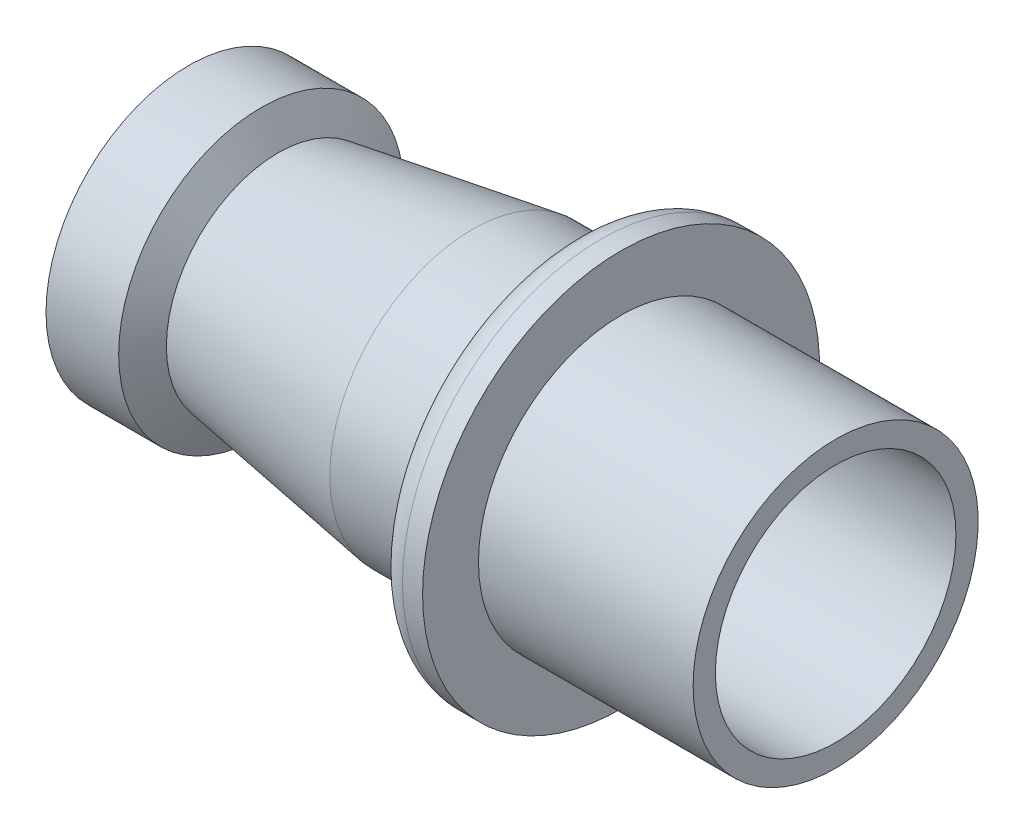
ISO-10303-21;
HEADER;
FILE_DESCRIPTION(('STEP AP214'),'2;1');
FILE_NAME('part.step','',(''),(''),'','','');
FILE_SCHEMA(('AUTOMOTIVE_DESIGN { 1 0 10303 214 1 1 1 1 }'));
ENDSEC;
DATA;
#1=APPLICATION_CONTEXT('core data for automotive mechanical design processes');
#2=APPLICATION_PROTOCOL_DEFINITION('international standard','automotive_design',2000,#1);
#3=PRODUCT_CONTEXT('',#1,'mechanical');
#4=PRODUCT('Part','Part','',(#3));
#5=PRODUCT_RELATED_PRODUCT_CATEGORY('part','',(#4));
#6=PRODUCT_DEFINITION_FORMATION('','',#4);
#7=PRODUCT_DEFINITION_CONTEXT('part definition',#1,'design');
#8=PRODUCT_DEFINITION('design','',#6,#7);
#9=PRODUCT_DEFINITION_SHAPE('','',#8);
#10=(LENGTH_UNIT() NAMED_UNIT(*) SI_UNIT(.MILLI.,.METRE.));
#11=(NAMED_UNIT(*) PLANE_ANGLE_UNIT() SI_UNIT($,.RADIAN.));
#12=(NAMED_UNIT(*) SI_UNIT($,.STERADIAN.) SOLID_ANGLE_UNIT());
#13=UNCERTAINTY_MEASURE_WITH_UNIT(LENGTH_MEASURE(1.E-05),#10,'distance_accuracy_value','');
#14=(GEOMETRIC_REPRESENTATION_CONTEXT(3) GLOBAL_UNCERTAINTY_ASSIGNED_CONTEXT((#13)) GLOBAL_UNIT_ASSIGNED_CONTEXT((#10,
#11,#12)) REPRESENTATION_CONTEXT('',''));
#15=CARTESIAN_POINT('',(0.,0.,0.));
#16=DIRECTION('',(0.,0.,1.));
#17=DIRECTION('',(1.,0.,0.));
#18=AXIS2_PLACEMENT_3D('',#15,#16,#17);
#19=CARTESIAN_POINT('',(82.894279842665,146.295332749387,0.));
#20=DIRECTION('',(-1.,0.,0.));
#21=DIRECTION('',(0.,0.,0.999999999999999));
#22=AXIS2_PLACEMENT_3D('',#19,#20,#21);
#23=CYLINDRICAL_SURFACE('',#22,0.647700000000001);
#24=CARTESIAN_POINT('',(87.1868798426582,146.295332749387,0.));
#25=DIRECTION('',(-1.,0.,0.));
#26=DIRECTION('',(0.,0.,0.999999999999999));
#27=AXIS2_PLACEMENT_3D('',#24,#25,#26);
#28=CIRCLE('',#27,0.647700000000001);
#29=CARTESIAN_POINT('',(87.1868798426582,146.295332749387,0.64769999999998));
#30=VERTEX_POINT('',#29);
#31=EDGE_CURVE('E99',#30,#30,#28,.T.);
#32=ORIENTED_EDGE('',*,*,#31,.F.);
#33=EDGE_LOOP('',(#32));
#34=FACE_BOUND('',#33,.T.);
#35=CARTESIAN_POINT('',(87.5170798426569,146.295332749387,0.));
#36=DIRECTION('',(-1.,0.,0.));
#37=DIRECTION('',(0.,0.,0.999999999999999));
#38=AXIS2_PLACEMENT_3D('',#35,#36,#37);
#39=CIRCLE('',#38,0.647700000000001);
#40=CARTESIAN_POINT('',(87.5170798426569,146.295332749387,0.64769999999998));
#41=VERTEX_POINT('',#40);
#42=EDGE_CURVE('E52',#41,#41,#39,.T.);
#43=ORIENTED_EDGE('',*,*,#42,.T.);
#44=EDGE_LOOP('',(#43));
#45=FACE_BOUND('',#44,.T.);
#46=ADVANCED_FACE('F39',(#34,#45),#23,.T.);
#47=CARTESIAN_POINT('',(87.5941597639321,146.295332749387,0.));
#48=DIRECTION('',(-1.,0.,0.));
#49=DIRECTION('',(0.,0.,0.999999999999999));
#50=AXIS2_PLACEMENT_3D('',#47,#48,#49);
#51=CONICAL_SURFACE('',#50,0.508000000000008,1.06660808974981);
#52=ORIENTED_EDGE('',*,*,#42,.F.);
#53=EDGE_LOOP('',(#52));
#54=FACE_BOUND('',#53,.T.);
#55=CARTESIAN_POINT('',(87.5941597639321,146.295332749387,0.));
#56=DIRECTION('',(-1.,0.,0.));
#57=DIRECTION('',(0.,0.,0.999999999999999));
#58=AXIS2_PLACEMENT_3D('',#55,#56,#57);
#59=CIRCLE('',#58,0.508000000000008);
#60=CARTESIAN_POINT('',(87.5941597639321,146.295332749387,0.507999999999987));
#61=VERTEX_POINT('',#60);
#62=EDGE_CURVE('E57',#61,#61,#59,.T.);
#63=ORIENTED_EDGE('',*,*,#62,.T.);
#64=EDGE_LOOP('',(#63));
#65=FACE_BOUND('',#64,.T.);
#66=ADVANCED_FACE('F108',(#54,#65),#51,.T.);
#67=CARTESIAN_POINT('',(88.4765268110271,146.295332749387,0.));
#68=DIRECTION('',(1.,0.,0.));
#69=DIRECTION('',(0.,0.,-0.999999999999999));
#70=AXIS2_PLACEMENT_3D('',#67,#68,#69);
#71=CONICAL_SURFACE('',#70,0.647699999992729,0.157020803145841);
#72=ORIENTED_EDGE('',*,*,#62,.F.);
#73=EDGE_LOOP('',(#72));
#74=FACE_BOUND('',#73,.T.);
#75=CARTESIAN_POINT('',(88.4765268110271,146.295332749387,0.));
#76=DIRECTION('',(-1.,0.,0.));
#77=DIRECTION('',(0.,0.,0.999999999999999));
#78=AXIS2_PLACEMENT_3D('',#75,#76,#77);
#79=CIRCLE('',#78,0.647699999992729);
#80=CARTESIAN_POINT('',(88.4765268110271,146.295332749387,0.647699999992708));
#81=VERTEX_POINT('',#80);
#82=EDGE_CURVE('E63',#81,#81,#79,.T.);
#83=ORIENTED_EDGE('',*,*,#82,.T.);
#84=EDGE_LOOP('',(#83));
#85=FACE_BOUND('',#84,.T.);
#86=ADVANCED_FACE('F113',(#74,#85),#71,.T.);
#87=CARTESIAN_POINT('',(82.894279842665,146.295332749387,0.));
#88=DIRECTION('',(-1.,0.,0.));
#89=DIRECTION('',(0.,0.,0.999999999999999));
#90=AXIS2_PLACEMENT_3D('',#87,#88,#89);
#91=CYLINDRICAL_SURFACE('',#90,0.647699999992729);
#92=ORIENTED_EDGE('',*,*,#82,.F.);
#93=EDGE_LOOP('',(#92));
#94=FACE_BOUND('',#93,.T.);
#95=CARTESIAN_POINT('',(88.8981668110271,146.295332749387,0.));
#96=DIRECTION('',(-1.,0.,0.));
#97=DIRECTION('',(0.,0.,0.999999999999999));
#98=AXIS2_PLACEMENT_3D('',#95,#96,#97);
#99=CIRCLE('',#98,0.647699999992729);
#100=CARTESIAN_POINT('',(88.8981668110271,146.295332749387,0.647699999992708));
#101=VERTEX_POINT('',#100);
#102=EDGE_CURVE('E67',#101,#101,#99,.T.);
#103=ORIENTED_EDGE('',*,*,#102,.T.);
#104=EDGE_LOOP('',(#103));
#105=FACE_BOUND('',#104,.T.);
#106=ADVANCED_FACE('F119',(#94,#105),#91,.T.);
#107=CARTESIAN_POINT('',(88.9616668110271,146.295332749387,0.));
#108=DIRECTION('',(1.,0.,0.));
#109=DIRECTION('',(0.,0.,-0.999999999999999));
#110=AXIS2_PLACEMENT_3D('',#107,#108,#109);
#111=CONICAL_SURFACE('',#110,0.901699999992733,1.32581766366801);
#112=CARTESIAN_POINT('',(88.937617317122,146.295332749387,0.));
#113=DIRECTION('',(-1.,0.,0.));
#114=DIRECTION('',(0.,0.,0.999999999999999));
#115=AXIS2_PLACEMENT_3D('',#112,#113,#114);
#116=CIRCLE('',#115,0.80550202437235);
#117=CARTESIAN_POINT('',(88.937617317122,146.295332749387,0.805502024372329));
#118=VERTEX_POINT('',#117);
#119=EDGE_CURVE('E47',#118,#118,#116,.T.);
#120=ORIENTED_EDGE('',*,*,#119,.T.);
#121=EDGE_LOOP('',(#120));
#122=FACE_BOUND('',#121,.T.);
#123=ORIENTED_EDGE('',*,*,#102,.F.);
#124=EDGE_LOOP('',(#123));
#125=FACE_BOUND('',#124,.T.);
#126=ADVANCED_FACE('F125',(#122,#125),#111,.T.);
#127=CARTESIAN_POINT('',(82.894279842665,146.295332749387,0.));
#128=DIRECTION('',(-1.,0.,0.));
#129=DIRECTION('',(0.,0.,0.999999999999999));
#130=AXIS2_PLACEMENT_3D('',#127,#128,#129);
#131=CYLINDRICAL_SURFACE('',#130,0.901699999992733);
#132=CARTESIAN_POINT('',(89.0608254146405,146.295332749387,0.));
#133=DIRECTION('',(1.,0.,0.));
#134=DIRECTION('',(0.,0.,-0.999999999999999));
#135=AXIS2_PLACEMENT_3D('',#132,#133,#134);
#136=CIRCLE('',#135,0.901699999992733);
#137=CARTESIAN_POINT('',(89.0608254146405,146.295332749387,-0.901699999992754));
#138=VERTEX_POINT('',#137);
#139=EDGE_CURVE('E10',#138,#138,#136,.T.);
#140=ORIENTED_EDGE('',*,*,#139,.T.);
#141=EDGE_LOOP('',(#140));
#142=FACE_BOUND('',#141,.T.);
#143=CARTESIAN_POINT('',(89.1521668110271,146.295332749387,0.));
#144=DIRECTION('',(-1.,0.,0.));
#145=DIRECTION('',(0.,0.,0.999999999999999));
#146=AXIS2_PLACEMENT_3D('',#143,#144,#145);
#147=CIRCLE('',#146,0.901699999992733);
#148=CARTESIAN_POINT('',(89.1521668110271,146.295332749387,0.901699999992712));
#149=VERTEX_POINT('',#148);
#150=EDGE_CURVE('E71',#149,#149,#147,.T.);
#151=ORIENTED_EDGE('',*,*,#150,.T.);
#152=EDGE_LOOP('',(#151));
#153=FACE_BOUND('',#152,.T.);
#154=ADVANCED_FACE('F130',(#142,#153),#131,.T.);
#155=CARTESIAN_POINT('',(89.1521668110271,147.19703274938,0.));
#156=DIRECTION('',(-1.,0.,0.));
#157=DIRECTION('',(0.,0.,0.999999999999999));
#158=AXIS2_PLACEMENT_3D('',#155,#156,#157);
#159=PLANE('',#158);
#160=ORIENTED_EDGE('',*,*,#150,.F.);
#161=EDGE_LOOP('',(#160));
#162=FACE_BOUND('',#161,.T.);
#163=CARTESIAN_POINT('',(89.1521668110271,146.295332749387,0.));
#164=DIRECTION('',(-1.,0.,0.));
#165=DIRECTION('',(0.,0.,0.999999999999999));
#166=AXIS2_PLACEMENT_3D('',#163,#164,#165);
#167=CIRCLE('',#166,0.647699999992729);
#168=CARTESIAN_POINT('',(89.1521668110271,146.295332749387,0.647699999992708));
#169=VERTEX_POINT('',#168);
#170=EDGE_CURVE('E75',#169,#169,#167,.T.);
#171=ORIENTED_EDGE('',*,*,#170,.T.);
#172=EDGE_LOOP('',(#171));
#173=FACE_BOUND('',#172,.T.);
#174=ADVANCED_FACE('F135',(#162,#173),#159,.F.);
#175=CARTESIAN_POINT('',(82.894279842665,146.295332749387,0.));
#176=DIRECTION('',(-1.,0.,0.));
#177=DIRECTION('',(0.,0.,0.999999999999999));
#178=AXIS2_PLACEMENT_3D('',#175,#176,#177);
#179=CYLINDRICAL_SURFACE('',#178,0.647699999992729);
#180=ORIENTED_EDGE('',*,*,#170,.F.);
#181=EDGE_LOOP('',(#180));
#182=FACE_BOUND('',#181,.T.);
#183=CARTESIAN_POINT('',(90.1275268110412,146.295332749387,0.));
#184=DIRECTION('',(-1.,0.,0.));
#185=DIRECTION('',(0.,0.,0.999999999999999));
#186=AXIS2_PLACEMENT_3D('',#183,#184,#185);
#187=CIRCLE('',#186,0.647699999992729);
#188=CARTESIAN_POINT('',(90.1275268110412,146.295332749387,0.647699999992708));
#189=VERTEX_POINT('',#188);
#190=EDGE_CURVE('E79',#189,#189,#187,.T.);
#191=ORIENTED_EDGE('',*,*,#190,.T.);
#192=EDGE_LOOP('',(#191));
#193=FACE_BOUND('',#192,.T.);
#194=ADVANCED_FACE('F140',(#182,#193),#179,.T.);
#195=CARTESIAN_POINT('',(90.1275268110412,146.94303274938,0.));
#196=DIRECTION('',(-1.,0.,0.));
#197=DIRECTION('',(0.,0.,0.999999999999999));
#198=AXIS2_PLACEMENT_3D('',#195,#196,#197);
#199=PLANE('',#198);
#200=ORIENTED_EDGE('',*,*,#190,.F.);
#201=EDGE_LOOP('',(#200));
#202=FACE_BOUND('',#201,.T.);
#203=CARTESIAN_POINT('',(90.1275268110412,146.295332749387,0.));
#204=DIRECTION('',(-1.,0.,0.));
#205=DIRECTION('',(0.,0.,0.999999999999999));
#206=AXIS2_PLACEMENT_3D('',#203,#204,#205);
#207=CIRCLE('',#206,0.546638375874042);
#208=CARTESIAN_POINT('',(90.1275268110412,146.295332749387,0.546638375874021));
#209=VERTEX_POINT('',#208);
#210=EDGE_CURVE('E83',#209,#209,#207,.T.);
#211=ORIENTED_EDGE('',*,*,#210,.T.);
#212=EDGE_LOOP('',(#211));
#213=FACE_BOUND('',#212,.T.);
#214=ADVANCED_FACE('F144',(#202,#213),#199,.F.);
#215=CARTESIAN_POINT('',(82.894279842665,146.295332749387,0.));
#216=DIRECTION('',(-1.,0.,0.));
#217=DIRECTION('',(0.,0.,0.999999999999999));
#218=AXIS2_PLACEMENT_3D('',#215,#216,#217);
#219=CYLINDRICAL_SURFACE('',#218,0.546638375874042);
#220=ORIENTED_EDGE('',*,*,#210,.F.);
#221=EDGE_LOOP('',(#220));
#222=FACE_BOUND('',#221,.T.);
#223=CARTESIAN_POINT('',(88.6289268110324,146.295332749387,0.));
#224=DIRECTION('',(-1.,0.,0.));
#225=DIRECTION('',(0.,0.,0.999999999999999));
#226=AXIS2_PLACEMENT_3D('',#223,#224,#225);
#227=CIRCLE('',#226,0.546638375874042);
#228=CARTESIAN_POINT('',(88.6289268110324,146.295332749387,0.546638375874021));
#229=VERTEX_POINT('',#228);
#230=EDGE_CURVE('E87',#229,#229,#227,.T.);
#231=ORIENTED_EDGE('',*,*,#230,.T.);
#232=EDGE_LOOP('',(#231));
#233=FACE_BOUND('',#232,.T.);
#234=ADVANCED_FACE('F148',(#222,#233),#219,.F.);
#235=CARTESIAN_POINT('',(88.6289268110324,146.841971125261,0.));
#236=DIRECTION('',(-1.,0.,0.));
#237=DIRECTION('',(0.,0.,0.999999999999999));
#238=AXIS2_PLACEMENT_3D('',#235,#236,#237);
#239=PLANE('',#238);
#240=ORIENTED_EDGE('',*,*,#230,.F.);
#241=EDGE_LOOP('',(#240));
#242=FACE_BOUND('',#241,.T.);
#243=CARTESIAN_POINT('',(88.6289268110324,146.295332749387,0.));
#244=DIRECTION('',(-1.,0.,0.));
#245=DIRECTION('',(0.,0.,0.999999999999999));
#246=AXIS2_PLACEMENT_3D('',#243,#244,#245);
#247=CIRCLE('',#246,0.419638375878856);
#248=CARTESIAN_POINT('',(88.6289268110324,146.295332749387,0.419638375878835));
#249=VERTEX_POINT('',#248);
#250=EDGE_CURVE('E91',#249,#249,#247,.T.);
#251=ORIENTED_EDGE('',*,*,#250,.T.);
#252=EDGE_LOOP('',(#251));
#253=FACE_BOUND('',#252,.T.);
#254=ADVANCED_FACE('F152',(#242,#253),#239,.F.);
#255=CARTESIAN_POINT('',(82.894279842665,146.295332749387,0.));
#256=DIRECTION('',(-1.,0.,0.));
#257=DIRECTION('',(0.,0.,0.999999999999999));
#258=AXIS2_PLACEMENT_3D('',#255,#256,#257);
#259=CYLINDRICAL_SURFACE('',#258,0.419638375878856);
#260=ORIENTED_EDGE('',*,*,#250,.F.);
#261=EDGE_LOOP('',(#260));
#262=FACE_BOUND('',#261,.T.);
#263=CARTESIAN_POINT('',(87.1868798426582,146.295332749387,0.));
#264=DIRECTION('',(-1.,0.,0.));
#265=DIRECTION('',(0.,0.,0.999999999999999));
#266=AXIS2_PLACEMENT_3D('',#263,#264,#265);
#267=CIRCLE('',#266,0.419638375878856);
#268=CARTESIAN_POINT('',(87.1868798426582,146.295332749387,0.419638375878835));
#269=VERTEX_POINT('',#268);
#270=EDGE_CURVE('E95',#269,#269,#267,.T.);
#271=ORIENTED_EDGE('',*,*,#270,.T.);
#272=EDGE_LOOP('',(#271));
#273=FACE_BOUND('',#272,.T.);
#274=ADVANCED_FACE('F156',(#262,#273),#259,.F.);
#275=CARTESIAN_POINT('',(87.1868798426582,146.943032749387,0.));
#276=DIRECTION('',(1.,0.,0.));
#277=DIRECTION('',(0.,0.,-0.999999999999999));
#278=AXIS2_PLACEMENT_3D('',#275,#276,#277);
#279=PLANE('',#278);
#280=ORIENTED_EDGE('',*,*,#270,.F.);
#281=EDGE_LOOP('',(#280));
#282=FACE_BOUND('',#281,.T.);
#283=ORIENTED_EDGE('',*,*,#31,.T.);
#284=EDGE_LOOP('',(#283));
#285=FACE_BOUND('',#284,.T.);
#286=ADVANCED_FACE('F104',(#282,#285),#279,.F.);
#287=CARTESIAN_POINT('',(89.0608254146405,146.295332749387,0.));
#288=DIRECTION('',(1.,0.,0.));
#289=DIRECTION('',(0.,0.,-0.999999999999999));
#290=AXIS2_PLACEMENT_3D('',#287,#288,#289);
#291=TOROIDAL_SURFACE('',#290,0.774699999992733,0.127);
#292=ORIENTED_EDGE('',*,*,#139,.F.);
#293=EDGE_LOOP('',(#292));
#294=FACE_BOUND('',#293,.T.);
#295=ORIENTED_EDGE('',*,*,#119,.F.);
#296=EDGE_LOOP('',(#295));
#297=FACE_BOUND('',#296,.T.);
#298=ADVANCED_FACE('F41',(#294,#297),#291,.T.);
#299=CLOSED_SHELL('',(#46,#66,#86,#106,#126,#154,#174,#194,#214,#234,#254,#274,#286,#298));
#300=MANIFOLD_SOLID_BREP('B2',#299);
#301=ADVANCED_BREP_SHAPE_REPRESENTATION('',(#18,#300),#14);
#302=SHAPE_DEFINITION_REPRESENTATION(#9,#301);
ENDSEC;
END-ISO-10303-21;
